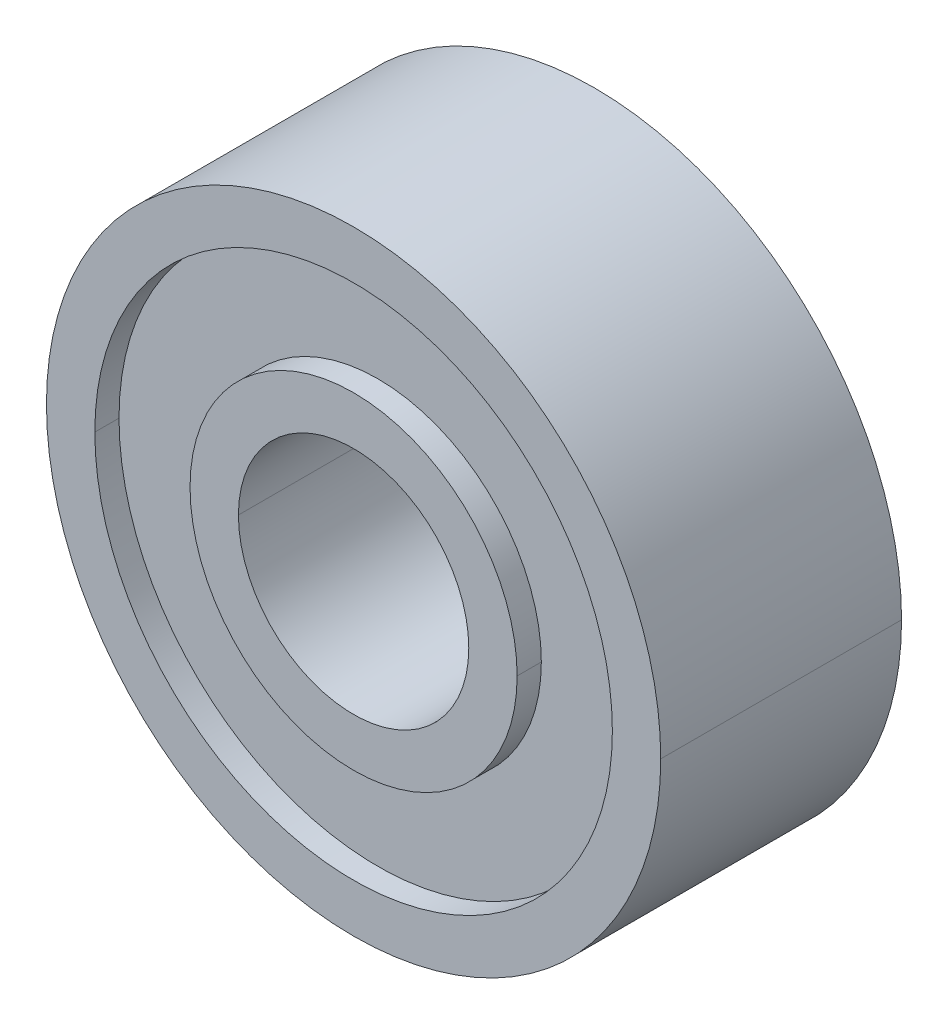
ISO-10303-21;
HEADER;
FILE_DESCRIPTION(('STEP AP214'),'2;1');
FILE_NAME('part.step','',(''),(''),'','','');
FILE_SCHEMA(('AUTOMOTIVE_DESIGN { 1 0 10303 214 1 1 1 1 }'));
ENDSEC;
DATA;
#1=APPLICATION_CONTEXT('core data for automotive mechanical design processes');
#2=APPLICATION_PROTOCOL_DEFINITION('international standard','automotive_design',2000,#1);
#3=PRODUCT_CONTEXT('',#1,'mechanical');
#4=PRODUCT('Part','Part','',(#3));
#5=PRODUCT_RELATED_PRODUCT_CATEGORY('part','',(#4));
#6=PRODUCT_DEFINITION_FORMATION('','',#4);
#7=PRODUCT_DEFINITION_CONTEXT('part definition',#1,'design');
#8=PRODUCT_DEFINITION('design','',#6,#7);
#9=PRODUCT_DEFINITION_SHAPE('','',#8);
#10=(LENGTH_UNIT() NAMED_UNIT(*) SI_UNIT(.MILLI.,.METRE.));
#11=(NAMED_UNIT(*) PLANE_ANGLE_UNIT() SI_UNIT($,.RADIAN.));
#12=(NAMED_UNIT(*) SI_UNIT($,.STERADIAN.) SOLID_ANGLE_UNIT());
#13=UNCERTAINTY_MEASURE_WITH_UNIT(LENGTH_MEASURE(1.E-05),#10,'distance_accuracy_value','');
#14=(GEOMETRIC_REPRESENTATION_CONTEXT(3) GLOBAL_UNCERTAINTY_ASSIGNED_CONTEXT((#13)) GLOBAL_UNIT_ASSIGNED_CONTEXT((#10,
#11,#12)) REPRESENTATION_CONTEXT('',''));
#15=CARTESIAN_POINT('',(0.,0.,0.));
#16=DIRECTION('',(0.,0.,1.));
#17=DIRECTION('',(1.,0.,0.));
#18=AXIS2_PLACEMENT_3D('',#15,#16,#17);
#19=CARTESIAN_POINT('',(0.,0.,-30.6024402864249));
#20=DIRECTION('',(0.,0.,-1.));
#21=DIRECTION('',(-1.,0.,0.));
#22=AXIS2_PLACEMENT_3D('',#19,#20,#21);
#23=CYLINDRICAL_SURFACE('',#22,2.38125);
#24=DIRECTION('',(0.,0.,-1.));
#25=VECTOR('',#24,1.);
#26=CARTESIAN_POINT('',(2.38125,0.,-30.6024402864249));
#27=LINE('',#26,#25);
#28=CARTESIAN_POINT('',(2.38125,0.,2.4892));
#29=VERTEX_POINT('',#28);
#30=CARTESIAN_POINT('',(2.38125,0.,-2.4892));
#31=VERTEX_POINT('',#30);
#32=EDGE_CURVE('E145',#29,#31,#27,.T.);
#33=ORIENTED_EDGE('',*,*,#32,.F.);
#34=CARTESIAN_POINT('',(0.,0.,2.4892));
#35=DIRECTION('',(0.,0.,-1.));
#36=DIRECTION('',(-1.,0.,0.));
#37=AXIS2_PLACEMENT_3D('',#34,#35,#36);
#38=CIRCLE('',#37,2.38125);
#39=CARTESIAN_POINT('',(-2.38125,0.,2.4892));
#40=VERTEX_POINT('',#39);
#41=EDGE_CURVE('E11',#40,#29,#38,.T.);
#42=ORIENTED_EDGE('',*,*,#41,.F.);
#43=DIRECTION('',(0.,0.,-1.));
#44=VECTOR('',#43,1.);
#45=CARTESIAN_POINT('',(-2.38125,0.,-30.6024402864249));
#46=LINE('',#45,#44);
#47=CARTESIAN_POINT('',(-2.38125,0.,-2.4892));
#48=VERTEX_POINT('',#47);
#49=EDGE_CURVE('E152',#40,#48,#46,.T.);
#50=ORIENTED_EDGE('',*,*,#49,.T.);
#51=CARTESIAN_POINT('',(0.,0.,-2.4892));
#52=DIRECTION('',(0.,0.,1.));
#53=DIRECTION('',(-1.,0.,0.));
#54=AXIS2_PLACEMENT_3D('',#51,#52,#53);
#55=CIRCLE('',#54,2.38125);
#56=EDGE_CURVE('E27',#31,#48,#55,.T.);
#57=ORIENTED_EDGE('',*,*,#56,.F.);
#58=EDGE_LOOP('',(#33,#42,#50,#57));
#59=FACE_BOUND('',#58,.T.);
#60=ADVANCED_FACE('F16',(#59),#23,.F.);
#61=CARTESIAN_POINT('',(0.,2.38125,2.4892));
#62=DIRECTION('',(0.,0.,1.));
#63=DIRECTION('',(1.,0.,0.));
#64=AXIS2_PLACEMENT_3D('',#61,#62,#63);
#65=PLANE('',#64);
#66=ORIENTED_EDGE('',*,*,#41,.T.);
#67=CARTESIAN_POINT('',(0.,0.,2.4892));
#68=DIRECTION('',(0.,0.,-1.));
#69=DIRECTION('',(-1.,0.,0.));
#70=AXIS2_PLACEMENT_3D('',#67,#68,#69);
#71=CIRCLE('',#70,2.38125);
#72=EDGE_CURVE('E141',#29,#40,#71,.T.);
#73=ORIENTED_EDGE('',*,*,#72,.T.);
#74=EDGE_LOOP('',(#66,#73));
#75=FACE_BOUND('',#74,.T.);
#76=CARTESIAN_POINT('',(0.,0.,2.4892));
#77=DIRECTION('',(0.,0.,-1.));
#78=DIRECTION('',(-1.,0.,0.));
#79=AXIS2_PLACEMENT_3D('',#76,#77,#78);
#80=CIRCLE('',#79,3.38125);
#81=CARTESIAN_POINT('',(-3.38125,0.,2.4892));
#82=VERTEX_POINT('',#81);
#83=CARTESIAN_POINT('',(3.38125,0.,2.4892));
#84=VERTEX_POINT('',#83);
#85=EDGE_CURVE('E177',#82,#84,#80,.T.);
#86=ORIENTED_EDGE('',*,*,#85,.F.);
#87=CARTESIAN_POINT('',(0.,0.,2.4892));
#88=DIRECTION('',(0.,0.,-1.));
#89=DIRECTION('',(-1.,0.,0.));
#90=AXIS2_PLACEMENT_3D('',#87,#88,#89);
#91=CIRCLE('',#90,3.38125);
#92=EDGE_CURVE('E168',#84,#82,#91,.T.);
#93=ORIENTED_EDGE('',*,*,#92,.F.);
#94=EDGE_LOOP('',(#86,#93));
#95=FACE_BOUND('',#94,.T.);
#96=ADVANCED_FACE('F138',(#75,#95),#65,.T.);
#97=CARTESIAN_POINT('',(0.,3.38125,-2.4892));
#98=DIRECTION('',(0.,0.,-1.));
#99=DIRECTION('',(0.,-1.,0.));
#100=AXIS2_PLACEMENT_3D('',#97,#98,#99);
#101=PLANE('',#100);
#102=CARTESIAN_POINT('',(0.,0.,-2.4892));
#103=DIRECTION('',(0.,0.,1.));
#104=DIRECTION('',(-1.,0.,0.));
#105=AXIS2_PLACEMENT_3D('',#102,#103,#104);
#106=CIRCLE('',#105,2.38125);
#107=EDGE_CURVE('E149',#48,#31,#106,.T.);
#108=ORIENTED_EDGE('',*,*,#107,.T.);
#109=ORIENTED_EDGE('',*,*,#56,.T.);
#110=EDGE_LOOP('',(#108,#109));
#111=FACE_BOUND('',#110,.T.);
#112=CARTESIAN_POINT('',(0.,0.,-2.4892));
#113=DIRECTION('',(0.,0.,1.));
#114=DIRECTION('',(-1.,0.,0.));
#115=AXIS2_PLACEMENT_3D('',#112,#113,#114);
#116=CIRCLE('',#115,3.38125);
#117=CARTESIAN_POINT('',(-3.38125,0.,-2.4892));
#118=VERTEX_POINT('',#117);
#119=CARTESIAN_POINT('',(3.38125,0.,-2.4892));
#120=VERTEX_POINT('',#119);
#121=EDGE_CURVE('E171',#118,#120,#116,.T.);
#122=ORIENTED_EDGE('',*,*,#121,.F.);
#123=CARTESIAN_POINT('',(0.,0.,-2.4892));
#124=DIRECTION('',(0.,0.,1.));
#125=DIRECTION('',(-1.,0.,0.));
#126=AXIS2_PLACEMENT_3D('',#123,#124,#125);
#127=CIRCLE('',#126,3.38125);
#128=EDGE_CURVE('E178',#120,#118,#127,.T.);
#129=ORIENTED_EDGE('',*,*,#128,.F.);
#130=EDGE_LOOP('',(#122,#129));
#131=FACE_BOUND('',#130,.T.);
#132=ADVANCED_FACE('F348',(#111,#131),#101,.T.);
#133=CARTESIAN_POINT('',(0.,0.,-30.6024402864249));
#134=DIRECTION('',(0.,0.,-1.));
#135=DIRECTION('',(-1.,0.,0.));
#136=AXIS2_PLACEMENT_3D('',#133,#134,#135);
#137=CYLINDRICAL_SURFACE('',#136,3.38125);
#138=DIRECTION('',(0.,0.,-1.));
#139=VECTOR('',#138,1.);
#140=CARTESIAN_POINT('',(3.38125,0.,-30.6024402864249));
#141=LINE('',#140,#139);
#142=CARTESIAN_POINT('',(3.38125,0.,1.9892));
#143=VERTEX_POINT('',#142);
#144=EDGE_CURVE('E187',#84,#143,#141,.T.);
#145=ORIENTED_EDGE('',*,*,#144,.F.);
#146=ORIENTED_EDGE('',*,*,#92,.T.);
#147=DIRECTION('',(0.,0.,-1.));
#148=VECTOR('',#147,1.);
#149=CARTESIAN_POINT('',(-3.38125,0.,-30.6024402864249));
#150=LINE('',#149,#148);
#151=CARTESIAN_POINT('',(-3.38125,0.,1.9892));
#152=VERTEX_POINT('',#151);
#153=EDGE_CURVE('E154',#82,#152,#150,.T.);
#154=ORIENTED_EDGE('',*,*,#153,.T.);
#155=CARTESIAN_POINT('',(0.,0.,1.9892));
#156=DIRECTION('',(0.,0.,-1.));
#157=DIRECTION('',(-1.,0.,0.));
#158=AXIS2_PLACEMENT_3D('',#155,#156,#157);
#159=CIRCLE('',#158,3.38125);
#160=EDGE_CURVE('E209',#143,#152,#159,.T.);
#161=ORIENTED_EDGE('',*,*,#160,.F.);
#162=EDGE_LOOP('',(#145,#146,#154,#161));
#163=FACE_BOUND('',#162,.T.);
#164=ADVANCED_FACE('F321',(#163),#137,.T.);
#165=CARTESIAN_POINT('',(0.,0.,-30.6024402864249));
#166=DIRECTION('',(0.,0.,-1.));
#167=DIRECTION('',(-1.,0.,0.));
#168=AXIS2_PLACEMENT_3D('',#165,#166,#167);
#169=CYLINDRICAL_SURFACE('',#168,3.38125);
#170=DIRECTION('',(0.,0.,-1.));
#171=VECTOR('',#170,1.);
#172=CARTESIAN_POINT('',(3.38125,0.,-30.6024402864249));
#173=LINE('',#172,#171);
#174=CARTESIAN_POINT('',(3.38125,0.,-1.9892));
#175=VERTEX_POINT('',#174);
#176=EDGE_CURVE('E190',#175,#120,#173,.T.);
#177=ORIENTED_EDGE('',*,*,#176,.F.);
#178=CARTESIAN_POINT('',(0.,0.,-1.9892));
#179=DIRECTION('',(0.,0.,1.));
#180=DIRECTION('',(-1.,0.,0.));
#181=AXIS2_PLACEMENT_3D('',#178,#179,#180);
#182=CIRCLE('',#181,3.38125);
#183=CARTESIAN_POINT('',(-3.38125,0.,-1.9892));
#184=VERTEX_POINT('',#183);
#185=EDGE_CURVE('E166',#184,#175,#182,.T.);
#186=ORIENTED_EDGE('',*,*,#185,.F.);
#187=DIRECTION('',(0.,0.,-1.));
#188=VECTOR('',#187,1.);
#189=CARTESIAN_POINT('',(-3.38125,0.,-30.6024402864249));
#190=LINE('',#189,#188);
#191=EDGE_CURVE('E174',#184,#118,#190,.T.);
#192=ORIENTED_EDGE('',*,*,#191,.T.);
#193=ORIENTED_EDGE('',*,*,#121,.T.);
#194=EDGE_LOOP('',(#177,#186,#192,#193));
#195=FACE_BOUND('',#194,.T.);
#196=ADVANCED_FACE('F316',(#195),#169,.T.);
#197=CARTESIAN_POINT('',(0.,3.38125,1.9892));
#198=DIRECTION('',(0.,0.,1.));
#199=DIRECTION('',(1.,0.,0.));
#200=AXIS2_PLACEMENT_3D('',#197,#198,#199);
#201=PLANE('',#200);
#202=CARTESIAN_POINT('',(0.,0.,1.9892));
#203=DIRECTION('',(0.,0.,-1.));
#204=DIRECTION('',(-1.,0.,0.));
#205=AXIS2_PLACEMENT_3D('',#202,#203,#204);
#206=CIRCLE('',#205,3.38125);
#207=EDGE_CURVE('E162',#152,#143,#206,.T.);
#208=ORIENTED_EDGE('',*,*,#207,.T.);
#209=ORIENTED_EDGE('',*,*,#160,.T.);
#210=EDGE_LOOP('',(#208,#209));
#211=FACE_BOUND('',#210,.T.);
#212=CARTESIAN_POINT('',(0.,0.,1.9892));
#213=DIRECTION('',(0.,0.,1.));
#214=DIRECTION('',(-1.,0.,0.));
#215=AXIS2_PLACEMENT_3D('',#212,#213,#214);
#216=CIRCLE('',#215,5.35);
#217=CARTESIAN_POINT('',(-5.35,0.,1.9892));
#218=VERTEX_POINT('',#217);
#219=CARTESIAN_POINT('',(5.35,0.,1.9892));
#220=VERTEX_POINT('',#219);
#221=EDGE_CURVE('E204',#218,#220,#216,.T.);
#222=ORIENTED_EDGE('',*,*,#221,.T.);
#223=CARTESIAN_POINT('',(0.,0.,1.9892));
#224=DIRECTION('',(0.,0.,1.));
#225=DIRECTION('',(-1.,0.,0.));
#226=AXIS2_PLACEMENT_3D('',#223,#224,#225);
#227=CIRCLE('',#226,5.35);
#228=EDGE_CURVE('E58',#220,#218,#227,.T.);
#229=ORIENTED_EDGE('',*,*,#228,.T.);
#230=EDGE_LOOP('',(#222,#229));
#231=FACE_BOUND('',#230,.T.);
#232=ADVANCED_FACE('F320',(#211,#231),#201,.T.);
#233=CARTESIAN_POINT('',(0.,5.35,-1.9892));
#234=DIRECTION('',(0.,0.,-1.));
#235=DIRECTION('',(0.,-1.,0.));
#236=AXIS2_PLACEMENT_3D('',#233,#234,#235);
#237=PLANE('',#236);
#238=ORIENTED_EDGE('',*,*,#185,.T.);
#239=CARTESIAN_POINT('',(0.,0.,-1.9892));
#240=DIRECTION('',(0.,0.,1.));
#241=DIRECTION('',(-1.,0.,0.));
#242=AXIS2_PLACEMENT_3D('',#239,#240,#241);
#243=CIRCLE('',#242,3.38125);
#244=EDGE_CURVE('E199',#175,#184,#243,.T.);
#245=ORIENTED_EDGE('',*,*,#244,.T.);
#246=EDGE_LOOP('',(#238,#245));
#247=FACE_BOUND('',#246,.T.);
#248=CARTESIAN_POINT('',(0.,0.,-1.9892));
#249=DIRECTION('',(0.,0.,-1.));
#250=DIRECTION('',(-1.,0.,0.));
#251=AXIS2_PLACEMENT_3D('',#248,#249,#250);
#252=CIRCLE('',#251,5.35);
#253=CARTESIAN_POINT('',(-5.35,0.,-1.9892));
#254=VERTEX_POINT('',#253);
#255=CARTESIAN_POINT('',(5.35,0.,-1.9892));
#256=VERTEX_POINT('',#255);
#257=EDGE_CURVE('E221',#254,#256,#252,.T.);
#258=ORIENTED_EDGE('',*,*,#257,.T.);
#259=CARTESIAN_POINT('',(0.,0.,-1.9892));
#260=DIRECTION('',(0.,0.,-1.));
#261=DIRECTION('',(-1.,0.,0.));
#262=AXIS2_PLACEMENT_3D('',#259,#260,#261);
#263=CIRCLE('',#262,5.35);
#264=EDGE_CURVE('E252',#256,#254,#263,.T.);
#265=ORIENTED_EDGE('',*,*,#264,.T.);
#266=EDGE_LOOP('',(#258,#265));
#267=FACE_BOUND('',#266,.T.);
#268=ADVANCED_FACE('F378',(#247,#267),#237,.T.);
#269=CARTESIAN_POINT('',(0.,0.,-30.6024402864249));
#270=DIRECTION('',(0.,0.,-1.));
#271=DIRECTION('',(-1.,0.,0.));
#272=AXIS2_PLACEMENT_3D('',#269,#270,#271);
#273=CYLINDRICAL_SURFACE('',#272,5.35);
#274=DIRECTION('',(0.,0.,-1.));
#275=VECTOR('',#274,1.);
#276=CARTESIAN_POINT('',(5.35,0.,-30.6024402864249));
#277=LINE('',#276,#275);
#278=CARTESIAN_POINT('',(5.35,0.,2.4892));
#279=VERTEX_POINT('',#278);
#280=EDGE_CURVE('E208',#279,#220,#277,.T.);
#281=ORIENTED_EDGE('',*,*,#280,.F.);
#282=CARTESIAN_POINT('',(0.,0.,2.4892));
#283=DIRECTION('',(0.,0.,-1.));
#284=DIRECTION('',(-1.,0.,0.));
#285=AXIS2_PLACEMENT_3D('',#282,#283,#284);
#286=CIRCLE('',#285,5.35);
#287=CARTESIAN_POINT('',(-5.35,0.,2.4892));
#288=VERTEX_POINT('',#287);
#289=EDGE_CURVE('E70',#288,#279,#286,.T.);
#290=ORIENTED_EDGE('',*,*,#289,.F.);
#291=DIRECTION('',(0.,0.,-1.));
#292=VECTOR('',#291,1.);
#293=CARTESIAN_POINT('',(-5.35,0.,-30.6024402864249));
#294=LINE('',#293,#292);
#295=EDGE_CURVE('E207',#288,#218,#294,.T.);
#296=ORIENTED_EDGE('',*,*,#295,.T.);
#297=ORIENTED_EDGE('',*,*,#228,.F.);
#298=EDGE_LOOP('',(#281,#290,#296,#297));
#299=FACE_BOUND('',#298,.T.);
#300=ADVANCED_FACE('F382',(#299),#273,.F.);
#301=CARTESIAN_POINT('',(0.,0.,-30.6024402864249));
#302=DIRECTION('',(0.,0.,-1.));
#303=DIRECTION('',(-1.,0.,0.));
#304=AXIS2_PLACEMENT_3D('',#301,#302,#303);
#305=CYLINDRICAL_SURFACE('',#304,5.35);
#306=DIRECTION('',(0.,0.,-1.));
#307=VECTOR('',#306,1.);
#308=CARTESIAN_POINT('',(5.35,0.,-30.6024402864249));
#309=LINE('',#308,#307);
#310=CARTESIAN_POINT('',(5.35,0.,-2.4892));
#311=VERTEX_POINT('',#310);
#312=EDGE_CURVE('E253',#256,#311,#309,.T.);
#313=ORIENTED_EDGE('',*,*,#312,.F.);
#314=ORIENTED_EDGE('',*,*,#257,.F.);
#315=DIRECTION('',(0.,0.,-1.));
#316=VECTOR('',#315,1.);
#317=CARTESIAN_POINT('',(-5.35,0.,-30.6024402864249));
#318=LINE('',#317,#316);
#319=CARTESIAN_POINT('',(-5.35,0.,-2.4892));
#320=VERTEX_POINT('',#319);
#321=EDGE_CURVE('E262',#254,#320,#318,.T.);
#322=ORIENTED_EDGE('',*,*,#321,.T.);
#323=CARTESIAN_POINT('',(0.,0.,-2.4892));
#324=DIRECTION('',(0.,0.,1.));
#325=DIRECTION('',(-1.,0.,0.));
#326=AXIS2_PLACEMENT_3D('',#323,#324,#325);
#327=CIRCLE('',#326,5.35);
#328=EDGE_CURVE('E172',#311,#320,#327,.T.);
#329=ORIENTED_EDGE('',*,*,#328,.F.);
#330=EDGE_LOOP('',(#313,#314,#322,#329));
#331=FACE_BOUND('',#330,.T.);
#332=ADVANCED_FACE('F280',(#331),#305,.F.);
#333=CARTESIAN_POINT('',(0.,5.35,2.4892));
#334=DIRECTION('',(0.,0.,1.));
#335=DIRECTION('',(1.,0.,0.));
#336=AXIS2_PLACEMENT_3D('',#333,#334,#335);
#337=PLANE('',#336);
#338=ORIENTED_EDGE('',*,*,#289,.T.);
#339=CARTESIAN_POINT('',(0.,0.,2.4892));
#340=DIRECTION('',(0.,0.,-1.));
#341=DIRECTION('',(-1.,0.,0.));
#342=AXIS2_PLACEMENT_3D('',#339,#340,#341);
#343=CIRCLE('',#342,5.35);
#344=EDGE_CURVE('E202',#279,#288,#343,.T.);
#345=ORIENTED_EDGE('',*,*,#344,.T.);
#346=EDGE_LOOP('',(#338,#345));
#347=FACE_BOUND('',#346,.T.);
#348=CARTESIAN_POINT('',(0.,0.,2.4892));
#349=DIRECTION('',(0.,0.,-1.));
#350=DIRECTION('',(-1.,0.,0.));
#351=AXIS2_PLACEMENT_3D('',#348,#349,#350);
#352=CIRCLE('',#351,6.35);
#353=CARTESIAN_POINT('',(-6.35,0.,2.4892));
#354=VERTEX_POINT('',#353);
#355=CARTESIAN_POINT('',(6.35,0.,2.4892));
#356=VERTEX_POINT('',#355);
#357=EDGE_CURVE('E247',#354,#356,#352,.T.);
#358=ORIENTED_EDGE('',*,*,#357,.F.);
#359=CARTESIAN_POINT('',(0.,0.,2.4892));
#360=DIRECTION('',(0.,0.,-1.));
#361=DIRECTION('',(-1.,0.,0.));
#362=AXIS2_PLACEMENT_3D('',#359,#360,#361);
#363=CIRCLE('',#362,6.35);
#364=EDGE_CURVE('E214',#356,#354,#363,.T.);
#365=ORIENTED_EDGE('',*,*,#364,.F.);
#366=EDGE_LOOP('',(#358,#365));
#367=FACE_BOUND('',#366,.T.);
#368=ADVANCED_FACE('F411',(#347,#367),#337,.T.);
#369=CARTESIAN_POINT('',(0.,6.35,-2.4892));
#370=DIRECTION('',(0.,0.,-1.));
#371=DIRECTION('',(0.,-1.,0.));
#372=AXIS2_PLACEMENT_3D('',#369,#370,#371);
#373=PLANE('',#372);
#374=CARTESIAN_POINT('',(0.,0.,-2.4892));
#375=DIRECTION('',(0.,0.,1.));
#376=DIRECTION('',(-1.,0.,0.));
#377=AXIS2_PLACEMENT_3D('',#374,#375,#376);
#378=CIRCLE('',#377,5.35);
#379=EDGE_CURVE('E257',#320,#311,#378,.T.);
#380=ORIENTED_EDGE('',*,*,#379,.T.);
#381=ORIENTED_EDGE('',*,*,#328,.T.);
#382=EDGE_LOOP('',(#380,#381));
#383=FACE_BOUND('',#382,.T.);
#384=CARTESIAN_POINT('',(0.,0.,-2.4892));
#385=DIRECTION('',(0.,0.,1.));
#386=DIRECTION('',(-1.,0.,0.));
#387=AXIS2_PLACEMENT_3D('',#384,#385,#386);
#388=CIRCLE('',#387,6.35);
#389=CARTESIAN_POINT('',(-6.35,0.,-2.4892));
#390=VERTEX_POINT('',#389);
#391=CARTESIAN_POINT('',(6.35,0.,-2.4892));
#392=VERTEX_POINT('',#391);
#393=EDGE_CURVE('E20',#390,#392,#388,.T.);
#394=ORIENTED_EDGE('',*,*,#393,.F.);
#395=CARTESIAN_POINT('',(0.,0.,-2.4892));
#396=DIRECTION('',(0.,0.,1.));
#397=DIRECTION('',(-1.,0.,0.));
#398=AXIS2_PLACEMENT_3D('',#395,#396,#397);
#399=CIRCLE('',#398,6.35);
#400=EDGE_CURVE('E240',#392,#390,#399,.T.);
#401=ORIENTED_EDGE('',*,*,#400,.F.);
#402=EDGE_LOOP('',(#394,#401));
#403=FACE_BOUND('',#402,.T.);
#404=ADVANCED_FACE('F274',(#383,#403),#373,.T.);
#405=CARTESIAN_POINT('',(0.,0.,-30.6024402864249));
#406=DIRECTION('',(0.,0.,-1.));
#407=DIRECTION('',(-1.,0.,0.));
#408=AXIS2_PLACEMENT_3D('',#405,#406,#407);
#409=CYLINDRICAL_SURFACE('',#408,6.35);
#410=DIRECTION('',(0.,0.,-1.));
#411=VECTOR('',#410,1.);
#412=CARTESIAN_POINT('',(6.35,0.,-30.6024402864249));
#413=LINE('',#412,#411);
#414=EDGE_CURVE('E243',#356,#392,#413,.T.);
#415=ORIENTED_EDGE('',*,*,#414,.F.);
#416=ORIENTED_EDGE('',*,*,#364,.T.);
#417=DIRECTION('',(0.,0.,-1.));
#418=VECTOR('',#417,1.);
#419=CARTESIAN_POINT('',(-6.35,0.,-30.6024402864249));
#420=LINE('',#419,#418);
#421=EDGE_CURVE('E248',#354,#390,#420,.T.);
#422=ORIENTED_EDGE('',*,*,#421,.T.);
#423=ORIENTED_EDGE('',*,*,#393,.T.);
#424=EDGE_LOOP('',(#415,#416,#422,#423));
#425=FACE_BOUND('',#424,.T.);
#426=ADVANCED_FACE('F331',(#425),#409,.T.);
#427=CARTESIAN_POINT('',(0.,0.,-30.6024402864249));
#428=DIRECTION('',(0.,0.,-1.));
#429=DIRECTION('',(-1.,0.,0.));
#430=AXIS2_PLACEMENT_3D('',#427,#428,#429);
#431=CYLINDRICAL_SURFACE('',#430,2.38125);
#432=ORIENTED_EDGE('',*,*,#72,.F.);
#433=ORIENTED_EDGE('',*,*,#32,.T.);
#434=ORIENTED_EDGE('',*,*,#107,.F.);
#435=ORIENTED_EDGE('',*,*,#49,.F.);
#436=EDGE_LOOP('',(#432,#433,#434,#435));
#437=FACE_BOUND('',#436,.T.);
#438=ADVANCED_FACE('F151',(#437),#431,.F.);
#439=CARTESIAN_POINT('',(0.,0.,-30.6024402864249));
#440=DIRECTION('',(0.,0.,-1.));
#441=DIRECTION('',(-1.,0.,0.));
#442=AXIS2_PLACEMENT_3D('',#439,#440,#441);
#443=CYLINDRICAL_SURFACE('',#442,3.38125);
#444=ORIENTED_EDGE('',*,*,#85,.T.);
#445=ORIENTED_EDGE('',*,*,#144,.T.);
#446=ORIENTED_EDGE('',*,*,#207,.F.);
#447=ORIENTED_EDGE('',*,*,#153,.F.);
#448=EDGE_LOOP('',(#444,#445,#446,#447));
#449=FACE_BOUND('',#448,.T.);
#450=ADVANCED_FACE('F310',(#449),#443,.T.);
#451=CARTESIAN_POINT('',(0.,0.,-30.6024402864249));
#452=DIRECTION('',(0.,0.,-1.));
#453=DIRECTION('',(-1.,0.,0.));
#454=AXIS2_PLACEMENT_3D('',#451,#452,#453);
#455=CYLINDRICAL_SURFACE('',#454,3.38125);
#456=ORIENTED_EDGE('',*,*,#244,.F.);
#457=ORIENTED_EDGE('',*,*,#176,.T.);
#458=ORIENTED_EDGE('',*,*,#128,.T.);
#459=ORIENTED_EDGE('',*,*,#191,.F.);
#460=EDGE_LOOP('',(#456,#457,#458,#459));
#461=FACE_BOUND('',#460,.T.);
#462=ADVANCED_FACE('F306',(#461),#455,.T.);
#463=CARTESIAN_POINT('',(0.,0.,-30.6024402864249));
#464=DIRECTION('',(0.,0.,-1.));
#465=DIRECTION('',(-1.,0.,0.));
#466=AXIS2_PLACEMENT_3D('',#463,#464,#465);
#467=CYLINDRICAL_SURFACE('',#466,5.35);
#468=ORIENTED_EDGE('',*,*,#344,.F.);
#469=ORIENTED_EDGE('',*,*,#280,.T.);
#470=ORIENTED_EDGE('',*,*,#221,.F.);
#471=ORIENTED_EDGE('',*,*,#295,.F.);
#472=EDGE_LOOP('',(#468,#469,#470,#471));
#473=FACE_BOUND('',#472,.T.);
#474=ADVANCED_FACE('F299',(#473),#467,.F.);
#475=CARTESIAN_POINT('',(0.,0.,-30.6024402864249));
#476=DIRECTION('',(0.,0.,-1.));
#477=DIRECTION('',(-1.,0.,0.));
#478=AXIS2_PLACEMENT_3D('',#475,#476,#477);
#479=CYLINDRICAL_SURFACE('',#478,5.35);
#480=ORIENTED_EDGE('',*,*,#264,.F.);
#481=ORIENTED_EDGE('',*,*,#312,.T.);
#482=ORIENTED_EDGE('',*,*,#379,.F.);
#483=ORIENTED_EDGE('',*,*,#321,.F.);
#484=EDGE_LOOP('',(#480,#481,#482,#483));
#485=FACE_BOUND('',#484,.T.);
#486=ADVANCED_FACE('F18',(#485),#479,.F.);
#487=CARTESIAN_POINT('',(0.,0.,-30.6024402864249));
#488=DIRECTION('',(0.,0.,-1.));
#489=DIRECTION('',(-1.,0.,0.));
#490=AXIS2_PLACEMENT_3D('',#487,#488,#489);
#491=CYLINDRICAL_SURFACE('',#490,6.35);
#492=ORIENTED_EDGE('',*,*,#357,.T.);
#493=ORIENTED_EDGE('',*,*,#414,.T.);
#494=ORIENTED_EDGE('',*,*,#400,.T.);
#495=ORIENTED_EDGE('',*,*,#421,.F.);
#496=EDGE_LOOP('',(#492,#493,#494,#495));
#497=FACE_BOUND('',#496,.T.);
#498=ADVANCED_FACE('F298',(#497),#491,.T.);
#499=CLOSED_SHELL('',(#60,#96,#132,#164,#196,#232,#268,#300,#332,#368,#404,#426,#438,#450,#462,
#474,#486,#498));
#500=MANIFOLD_SOLID_BREP('B1',#499);
#501=ADVANCED_BREP_SHAPE_REPRESENTATION('',(#18,#500),#14);
#502=SHAPE_DEFINITION_REPRESENTATION(#9,#501);
ENDSEC;
END-ISO-10303-21;
